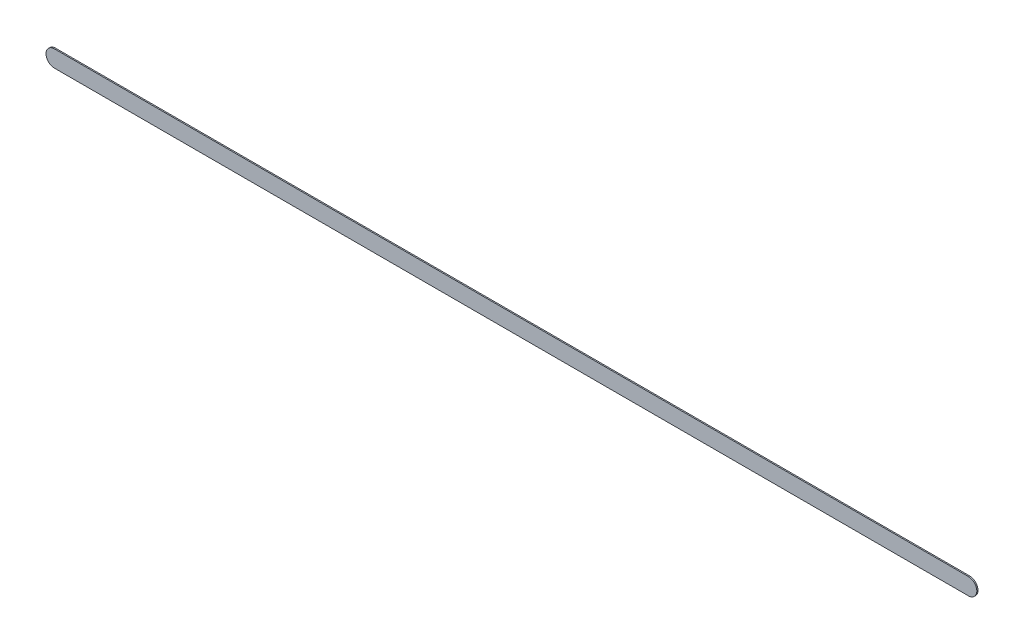
ISO-10303-21;
HEADER;
FILE_DESCRIPTION(('STEP AP214'),'2;1');
FILE_NAME('part.step','',(''),(''),'','','');
FILE_SCHEMA(('AUTOMOTIVE_DESIGN { 1 0 10303 214 1 1 1 1 }'));
ENDSEC;
DATA;
#1=APPLICATION_CONTEXT('core data for automotive mechanical design processes');
#2=APPLICATION_PROTOCOL_DEFINITION('international standard','automotive_design',2000,#1);
#3=PRODUCT_CONTEXT('',#1,'mechanical');
#4=PRODUCT('Part','Part','',(#3));
#5=PRODUCT_RELATED_PRODUCT_CATEGORY('part','',(#4));
#6=PRODUCT_DEFINITION_FORMATION('','',#4);
#7=PRODUCT_DEFINITION_CONTEXT('part definition',#1,'design');
#8=PRODUCT_DEFINITION('design','',#6,#7);
#9=PRODUCT_DEFINITION_SHAPE('','',#8);
#10=(LENGTH_UNIT() NAMED_UNIT(*) SI_UNIT(.MILLI.,.METRE.));
#11=(NAMED_UNIT(*) PLANE_ANGLE_UNIT() SI_UNIT($,.RADIAN.));
#12=(NAMED_UNIT(*) SI_UNIT($,.STERADIAN.) SOLID_ANGLE_UNIT());
#13=UNCERTAINTY_MEASURE_WITH_UNIT(LENGTH_MEASURE(1.E-05),#10,'distance_accuracy_value','');
#14=(GEOMETRIC_REPRESENTATION_CONTEXT(3) GLOBAL_UNCERTAINTY_ASSIGNED_CONTEXT((#13)) GLOBAL_UNIT_ASSIGNED_CONTEXT((#10,
#11,#12)) REPRESENTATION_CONTEXT('',''));
#15=CARTESIAN_POINT('',(0.,0.,0.));
#16=DIRECTION('',(0.,0.,1.));
#17=DIRECTION('',(1.,0.,0.));
#18=AXIS2_PLACEMENT_3D('',#15,#16,#17);
#19=CARTESIAN_POINT('',(62.1588292,72.8512005,0.));
#20=DIRECTION('',(0.,1.,0.));
#21=DIRECTION('',(1.,0.,0.));
#22=AXIS2_PLACEMENT_3D('',#19,#20,#21);
#23=PLANE('',#22);
#24=DIRECTION('',(1.,0.,0.));
#25=VECTOR('',#24,1.);
#26=CARTESIAN_POINT('',(62.1588292,72.8512005,0.03556));
#27=LINE('',#26,#25);
#28=CARTESIAN_POINT('',(62.1588292,72.8512005,0.03556));
#29=VERTEX_POINT('',#28);
#30=CARTESIAN_POINT('',(89.50120022,72.8512005,0.03556));
#31=VERTEX_POINT('',#30);
#32=EDGE_CURVE('E11',#29,#31,#27,.T.);
#33=ORIENTED_EDGE('',*,*,#32,.F.);
#34=DIRECTION('',(0.,0.,1.));
#35=VECTOR('',#34,1.);
#36=CARTESIAN_POINT('',(62.1588292,72.8512005,0.));
#37=LINE('',#36,#35);
#38=CARTESIAN_POINT('',(62.1588292,72.8512005,0.));
#39=VERTEX_POINT('',#38);
#40=EDGE_CURVE('E24',#39,#29,#37,.T.);
#41=ORIENTED_EDGE('',*,*,#40,.F.);
#42=DIRECTION('',(1.,0.,0.));
#43=VECTOR('',#42,1.);
#44=CARTESIAN_POINT('',(62.1588292,72.8512005,0.));
#45=LINE('',#44,#43);
#46=CARTESIAN_POINT('',(89.50120022,72.8512005,0.));
#47=VERTEX_POINT('',#46);
#48=EDGE_CURVE('E75',#39,#47,#45,.T.);
#49=ORIENTED_EDGE('',*,*,#48,.T.);
#50=DIRECTION('',(0.,0.,1.));
#51=VECTOR('',#50,1.);
#52=CARTESIAN_POINT('',(89.50120022,72.8512005,0.));
#53=LINE('',#52,#51);
#54=EDGE_CURVE('E37',#47,#31,#53,.T.);
#55=ORIENTED_EDGE('',*,*,#54,.T.);
#56=EDGE_LOOP('',(#33,#41,#49,#55));
#57=FACE_BOUND('',#56,.T.);
#58=ADVANCED_FACE('F17',(#57),#23,.F.);
#59=CARTESIAN_POINT('',(89.50120022,73.1012,0.));
#60=DIRECTION('',(0.,0.,-1.));
#61=DIRECTION('',(0.,-1.,0.));
#62=AXIS2_PLACEMENT_3D('',#59,#60,#61);
#63=CYLINDRICAL_SURFACE('',#62,0.249999499999997);
#64=CARTESIAN_POINT('',(89.50120022,73.1012,0.03556));
#65=DIRECTION('',(0.,0.,1.));
#66=DIRECTION('',(0.,-1.,0.));
#67=AXIS2_PLACEMENT_3D('',#64,#65,#66);
#68=CIRCLE('',#67,0.249999499999997);
#69=CARTESIAN_POINT('',(89.50120022,73.3511995,0.03556));
#70=VERTEX_POINT('',#69);
#71=EDGE_CURVE('E83',#31,#70,#68,.T.);
#72=ORIENTED_EDGE('',*,*,#71,.F.);
#73=ORIENTED_EDGE('',*,*,#54,.F.);
#74=CARTESIAN_POINT('',(89.50120022,73.1012,0.));
#75=DIRECTION('',(0.,0.,1.));
#76=DIRECTION('',(0.,-1.,0.));
#77=AXIS2_PLACEMENT_3D('',#74,#75,#76);
#78=CIRCLE('',#77,0.249999499999997);
#79=CARTESIAN_POINT('',(89.50120022,73.3511995,0.));
#80=VERTEX_POINT('',#79);
#81=EDGE_CURVE('E81',#47,#80,#78,.T.);
#82=ORIENTED_EDGE('',*,*,#81,.T.);
#83=DIRECTION('',(0.,0.,1.));
#84=VECTOR('',#83,1.);
#85=CARTESIAN_POINT('',(89.50120022,73.3511995,0.));
#86=LINE('',#85,#84);
#87=EDGE_CURVE('E67',#80,#70,#86,.T.);
#88=ORIENTED_EDGE('',*,*,#87,.T.);
#89=EDGE_LOOP('',(#72,#73,#82,#88));
#90=FACE_BOUND('',#89,.T.);
#91=ADVANCED_FACE('F89',(#90),#63,.T.);
#92=CARTESIAN_POINT('',(89.50120022,73.3511995,0.));
#93=DIRECTION('',(0.,-1.,0.));
#94=DIRECTION('',(-1.,0.,0.));
#95=AXIS2_PLACEMENT_3D('',#92,#93,#94);
#96=PLANE('',#95);
#97=DIRECTION('',(-1.,0.,0.));
#98=VECTOR('',#97,1.);
#99=CARTESIAN_POINT('',(89.50120022,73.3511995,0.03556));
#100=LINE('',#99,#98);
#101=CARTESIAN_POINT('',(62.1588292,73.3511995,0.03556));
#102=VERTEX_POINT('',#101);
#103=EDGE_CURVE('E71',#70,#102,#100,.T.);
#104=ORIENTED_EDGE('',*,*,#103,.F.);
#105=ORIENTED_EDGE('',*,*,#87,.F.);
#106=DIRECTION('',(-1.,0.,0.));
#107=VECTOR('',#106,1.);
#108=CARTESIAN_POINT('',(89.50120022,73.3511995,0.));
#109=LINE('',#108,#107);
#110=CARTESIAN_POINT('',(62.1588292,73.3511995,0.));
#111=VERTEX_POINT('',#110);
#112=EDGE_CURVE('E63',#80,#111,#109,.T.);
#113=ORIENTED_EDGE('',*,*,#112,.T.);
#114=DIRECTION('',(0.,0.,1.));
#115=VECTOR('',#114,1.);
#116=CARTESIAN_POINT('',(62.1588292,73.3511995,0.));
#117=LINE('',#116,#115);
#118=EDGE_CURVE('E53',#111,#102,#117,.T.);
#119=ORIENTED_EDGE('',*,*,#118,.T.);
#120=EDGE_LOOP('',(#104,#105,#113,#119));
#121=FACE_BOUND('',#120,.T.);
#122=ADVANCED_FACE('F66',(#121),#96,.F.);
#123=CARTESIAN_POINT('',(62.1588292,73.1012,0.));
#124=DIRECTION('',(0.,0.,-1.));
#125=DIRECTION('',(0.,1.,0.));
#126=AXIS2_PLACEMENT_3D('',#123,#124,#125);
#127=CYLINDRICAL_SURFACE('',#126,0.249999499999994);
#128=CARTESIAN_POINT('',(62.1588292,73.1012,0.03556));
#129=DIRECTION('',(0.,0.,1.));
#130=DIRECTION('',(0.,1.,0.));
#131=AXIS2_PLACEMENT_3D('',#128,#129,#130);
#132=CIRCLE('',#131,0.249999499999994);
#133=EDGE_CURVE('E59',#102,#29,#132,.T.);
#134=ORIENTED_EDGE('',*,*,#133,.F.);
#135=ORIENTED_EDGE('',*,*,#118,.F.);
#136=CARTESIAN_POINT('',(62.1588292,73.1012,0.));
#137=DIRECTION('',(0.,0.,1.));
#138=DIRECTION('',(0.,1.,0.));
#139=AXIS2_PLACEMENT_3D('',#136,#137,#138);
#140=CIRCLE('',#139,0.249999499999994);
#141=EDGE_CURVE('E57',#111,#39,#140,.T.);
#142=ORIENTED_EDGE('',*,*,#141,.T.);
#143=ORIENTED_EDGE('',*,*,#40,.T.);
#144=EDGE_LOOP('',(#134,#135,#142,#143));
#145=FACE_BOUND('',#144,.T.);
#146=ADVANCED_FACE('F55',(#145),#127,.T.);
#147=CARTESIAN_POINT('',(62.1588292,72.8512005,0.));
#148=DIRECTION('',(0.,0.,-1.));
#149=DIRECTION('',(-1.,0.,0.));
#150=AXIS2_PLACEMENT_3D('',#147,#148,#149);
#151=PLANE('',#150);
#152=ORIENTED_EDGE('',*,*,#141,.F.);
#153=ORIENTED_EDGE('',*,*,#112,.F.);
#154=ORIENTED_EDGE('',*,*,#81,.F.);
#155=ORIENTED_EDGE('',*,*,#48,.F.);
#156=EDGE_LOOP('',(#152,#153,#154,#155));
#157=FACE_BOUND('',#156,.T.);
#158=ADVANCED_FACE('F74',(#157),#151,.T.);
#159=CARTESIAN_POINT('',(62.1588292,72.8512005,0.03556));
#160=DIRECTION('',(0.,0.,-1.));
#161=DIRECTION('',(-1.,0.,0.));
#162=AXIS2_PLACEMENT_3D('',#159,#160,#161);
#163=PLANE('',#162);
#164=ORIENTED_EDGE('',*,*,#32,.T.);
#165=ORIENTED_EDGE('',*,*,#71,.T.);
#166=ORIENTED_EDGE('',*,*,#103,.T.);
#167=ORIENTED_EDGE('',*,*,#133,.T.);
#168=EDGE_LOOP('',(#164,#165,#166,#167));
#169=FACE_BOUND('',#168,.T.);
#170=ADVANCED_FACE('F91',(#169),#163,.F.);
#171=CLOSED_SHELL('',(#58,#91,#122,#146,#158,#170));
#172=MANIFOLD_SOLID_BREP('B1',#171);
#173=ADVANCED_BREP_SHAPE_REPRESENTATION('',(#18,#172),#14);
#174=SHAPE_DEFINITION_REPRESENTATION(#9,#173);
ENDSEC;
END-ISO-10303-21;
